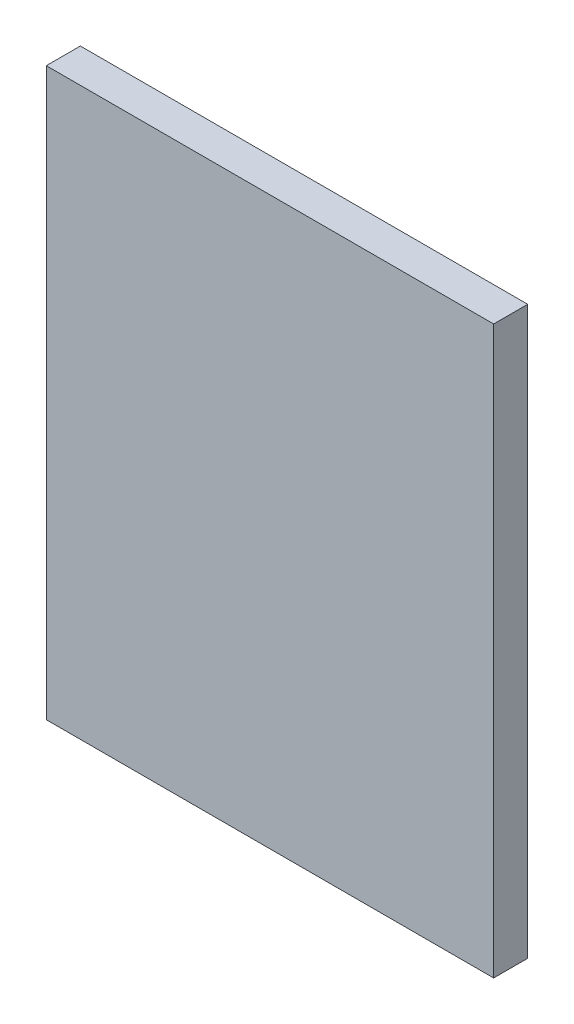
ISO-10303-21;
HEADER;
FILE_DESCRIPTION(('STEP AP214'),'2;1');
FILE_NAME('part.step','',(''),(''),'','','');
FILE_SCHEMA(('AUTOMOTIVE_DESIGN { 1 0 10303 214 1 1 1 1 }'));
ENDSEC;
DATA;
#1=APPLICATION_CONTEXT('core data for automotive mechanical design processes');
#2=APPLICATION_PROTOCOL_DEFINITION('international standard','automotive_design',2000,#1);
#3=PRODUCT_CONTEXT('',#1,'mechanical');
#4=PRODUCT('Part','Part','',(#3));
#5=PRODUCT_RELATED_PRODUCT_CATEGORY('part','',(#4));
#6=PRODUCT_DEFINITION_FORMATION('','',#4);
#7=PRODUCT_DEFINITION_CONTEXT('part definition',#1,'design');
#8=PRODUCT_DEFINITION('design','',#6,#7);
#9=PRODUCT_DEFINITION_SHAPE('','',#8);
#10=(LENGTH_UNIT() NAMED_UNIT(*) SI_UNIT(.MILLI.,.METRE.));
#11=(NAMED_UNIT(*) PLANE_ANGLE_UNIT() SI_UNIT($,.RADIAN.));
#12=(NAMED_UNIT(*) SI_UNIT($,.STERADIAN.) SOLID_ANGLE_UNIT());
#13=UNCERTAINTY_MEASURE_WITH_UNIT(LENGTH_MEASURE(1.E-05),#10,'distance_accuracy_value','');
#14=(GEOMETRIC_REPRESENTATION_CONTEXT(3) GLOBAL_UNCERTAINTY_ASSIGNED_CONTEXT((#13)) GLOBAL_UNIT_ASSIGNED_CONTEXT((#10,
#11,#12)) REPRESENTATION_CONTEXT('',''));
#15=CARTESIAN_POINT('',(0.,0.,0.));
#16=DIRECTION('',(0.,0.,1.));
#17=DIRECTION('',(1.,0.,0.));
#18=AXIS2_PLACEMENT_3D('',#15,#16,#17);
#19=CARTESIAN_POINT('',(-6.4262,-9.2456,1.));
#20=DIRECTION('',(1.,0.,0.));
#21=DIRECTION('',(0.,0.,-1.));
#22=AXIS2_PLACEMENT_3D('',#19,#20,#21);
#23=PLANE('',#22);
#24=DIRECTION('',(0.,-1.,0.));
#25=VECTOR('',#24,1.);
#26=CARTESIAN_POINT('',(-6.4262,-9.2456,0.));
#27=LINE('',#26,#25);
#28=CARTESIAN_POINT('',(-6.4262,7.379997,0.));
#29=VERTEX_POINT('',#28);
#30=CARTESIAN_POINT('',(-6.4262,-9.2456,0.));
#31=VERTEX_POINT('',#30);
#32=EDGE_CURVE('E95',#29,#31,#27,.T.);
#33=ORIENTED_EDGE('',*,*,#32,.T.);
#34=DIRECTION('',(0.,0.,-1.));
#35=VECTOR('',#34,1.);
#36=CARTESIAN_POINT('',(-6.4262,-9.2456,1.));
#37=LINE('',#36,#35);
#38=CARTESIAN_POINT('',(-6.4262,-9.2456,1.));
#39=VERTEX_POINT('',#38);
#40=EDGE_CURVE('E11',#39,#31,#37,.T.);
#41=ORIENTED_EDGE('',*,*,#40,.F.);
#42=DIRECTION('',(0.,-1.,0.));
#43=VECTOR('',#42,1.);
#44=CARTESIAN_POINT('',(-6.4262,-9.2456,1.));
#45=LINE('',#44,#43);
#46=CARTESIAN_POINT('',(-6.4262,7.379997,1.));
#47=VERTEX_POINT('',#46);
#48=EDGE_CURVE('E83',#47,#39,#45,.T.);
#49=ORIENTED_EDGE('',*,*,#48,.F.);
#50=DIRECTION('',(0.,0.,-1.));
#51=VECTOR('',#50,1.);
#52=CARTESIAN_POINT('',(-6.4262,7.379997,1.));
#53=LINE('',#52,#51);
#54=EDGE_CURVE('E91',#47,#29,#53,.T.);
#55=ORIENTED_EDGE('',*,*,#54,.T.);
#56=EDGE_LOOP('',(#33,#41,#49,#55));
#57=FACE_BOUND('',#56,.T.);
#58=ADVANCED_FACE('F32',(#57),#23,.F.);
#59=CARTESIAN_POINT('',(6.7056,-9.2456,1.));
#60=DIRECTION('',(0.,1.,0.));
#61=DIRECTION('',(0.,0.,1.));
#62=AXIS2_PLACEMENT_3D('',#59,#60,#61);
#63=PLANE('',#62);
#64=DIRECTION('',(1.,0.,0.));
#65=VECTOR('',#64,1.);
#66=CARTESIAN_POINT('',(6.7056,-9.2456,0.));
#67=LINE('',#66,#65);
#68=CARTESIAN_POINT('',(6.7056,-9.2456,0.));
#69=VERTEX_POINT('',#68);
#70=EDGE_CURVE('E87',#31,#69,#67,.T.);
#71=ORIENTED_EDGE('',*,*,#70,.T.);
#72=DIRECTION('',(0.,0.,-1.));
#73=VECTOR('',#72,1.);
#74=CARTESIAN_POINT('',(6.7056,-9.2456,1.));
#75=LINE('',#74,#73);
#76=CARTESIAN_POINT('',(6.7056,-9.2456,1.));
#77=VERTEX_POINT('',#76);
#78=EDGE_CURVE('E40',#77,#69,#75,.T.);
#79=ORIENTED_EDGE('',*,*,#78,.F.);
#80=DIRECTION('',(1.,0.,0.));
#81=VECTOR('',#80,1.);
#82=CARTESIAN_POINT('',(6.7056,-9.2456,1.));
#83=LINE('',#82,#81);
#84=EDGE_CURVE('E78',#39,#77,#83,.T.);
#85=ORIENTED_EDGE('',*,*,#84,.F.);
#86=ORIENTED_EDGE('',*,*,#40,.T.);
#87=EDGE_LOOP('',(#71,#79,#85,#86));
#88=FACE_BOUND('',#87,.T.);
#89=ADVANCED_FACE('F86',(#88),#63,.F.);
#90=CARTESIAN_POINT('',(6.7056,7.379997,1.));
#91=DIRECTION('',(-1.,0.,0.));
#92=DIRECTION('',(0.,0.,1.));
#93=AXIS2_PLACEMENT_3D('',#90,#91,#92);
#94=PLANE('',#93);
#95=DIRECTION('',(0.,1.,0.));
#96=VECTOR('',#95,1.);
#97=CARTESIAN_POINT('',(6.7056,7.379997,0.));
#98=LINE('',#97,#96);
#99=CARTESIAN_POINT('',(6.7056,7.379997,0.));
#100=VERTEX_POINT('',#99);
#101=EDGE_CURVE('E65',#69,#100,#98,.T.);
#102=ORIENTED_EDGE('',*,*,#101,.T.);
#103=DIRECTION('',(0.,0.,-1.));
#104=VECTOR('',#103,1.);
#105=CARTESIAN_POINT('',(6.7056,7.379997,1.));
#106=LINE('',#105,#104);
#107=CARTESIAN_POINT('',(6.7056,7.379997,1.));
#108=VERTEX_POINT('',#107);
#109=EDGE_CURVE('E88',#108,#100,#106,.T.);
#110=ORIENTED_EDGE('',*,*,#109,.F.);
#111=DIRECTION('',(0.,1.,0.));
#112=VECTOR('',#111,1.);
#113=CARTESIAN_POINT('',(6.7056,7.379997,1.));
#114=LINE('',#113,#112);
#115=EDGE_CURVE('E81',#77,#108,#114,.T.);
#116=ORIENTED_EDGE('',*,*,#115,.F.);
#117=ORIENTED_EDGE('',*,*,#78,.T.);
#118=EDGE_LOOP('',(#102,#110,#116,#117));
#119=FACE_BOUND('',#118,.T.);
#120=ADVANCED_FACE('F89',(#119),#94,.F.);
#121=CARTESIAN_POINT('',(-6.4262,7.379997,1.));
#122=DIRECTION('',(0.,-1.,0.));
#123=DIRECTION('',(0.,0.,-1.));
#124=AXIS2_PLACEMENT_3D('',#121,#122,#123);
#125=PLANE('',#124);
#126=DIRECTION('',(-1.,0.,0.));
#127=VECTOR('',#126,1.);
#128=CARTESIAN_POINT('',(-6.4262,7.379997,0.));
#129=LINE('',#128,#127);
#130=EDGE_CURVE('E71',#100,#29,#129,.T.);
#131=ORIENTED_EDGE('',*,*,#130,.T.);
#132=ORIENTED_EDGE('',*,*,#54,.F.);
#133=DIRECTION('',(-1.,0.,0.));
#134=VECTOR('',#133,1.);
#135=CARTESIAN_POINT('',(-6.4262,7.379997,1.));
#136=LINE('',#135,#134);
#137=EDGE_CURVE('E48',#108,#47,#136,.T.);
#138=ORIENTED_EDGE('',*,*,#137,.F.);
#139=ORIENTED_EDGE('',*,*,#109,.T.);
#140=EDGE_LOOP('',(#131,#132,#138,#139));
#141=FACE_BOUND('',#140,.T.);
#142=ADVANCED_FACE('F102',(#141),#125,.F.);
#143=CARTESIAN_POINT('',(0.,0.,1.));
#144=DIRECTION('',(0.,0.,-1.));
#145=DIRECTION('',(-1.,0.,0.));
#146=AXIS2_PLACEMENT_3D('',#143,#144,#145);
#147=PLANE('',#146);
#148=ORIENTED_EDGE('',*,*,#48,.T.);
#149=ORIENTED_EDGE('',*,*,#84,.T.);
#150=ORIENTED_EDGE('',*,*,#115,.T.);
#151=ORIENTED_EDGE('',*,*,#137,.T.);
#152=EDGE_LOOP('',(#148,#149,#150,#151));
#153=FACE_BOUND('',#152,.T.);
#154=ADVANCED_FACE('F79',(#153),#147,.F.);
#155=CARTESIAN_POINT('',(0.,0.,0.));
#156=DIRECTION('',(0.,0.,-1.));
#157=DIRECTION('',(-1.,0.,0.));
#158=AXIS2_PLACEMENT_3D('',#155,#156,#157);
#159=PLANE('',#158);
#160=ORIENTED_EDGE('',*,*,#32,.F.);
#161=ORIENTED_EDGE('',*,*,#130,.F.);
#162=ORIENTED_EDGE('',*,*,#101,.F.);
#163=ORIENTED_EDGE('',*,*,#70,.F.);
#164=EDGE_LOOP('',(#160,#161,#162,#163));
#165=FACE_BOUND('',#164,.T.);
#166=ADVANCED_FACE('F105',(#165),#159,.T.);
#167=CLOSED_SHELL('',(#58,#89,#120,#142,#154,#166));
#168=MANIFOLD_SOLID_BREP('B2',#167);
#169=ADVANCED_BREP_SHAPE_REPRESENTATION('',(#18,#168),#14);
#170=SHAPE_DEFINITION_REPRESENTATION(#9,#169);
ENDSEC;
END-ISO-10303-21;
